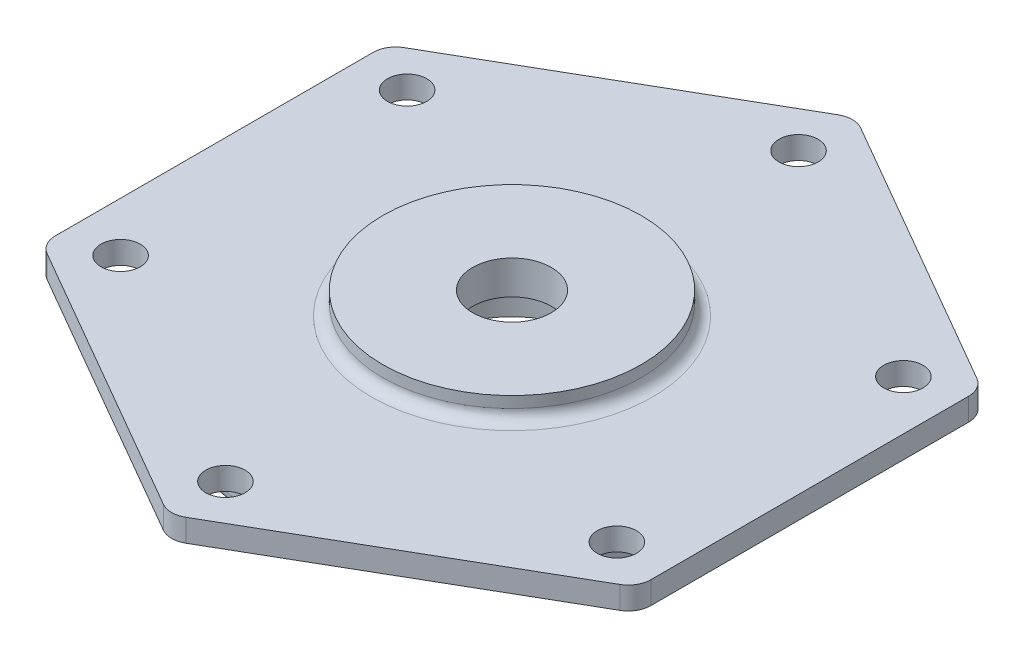
ISO-10303-21;
HEADER;
FILE_DESCRIPTION(('STEP AP214'),'2;1');
FILE_NAME('part.step','',(''),(''),'','','');
FILE_SCHEMA(('AUTOMOTIVE_DESIGN { 1 0 10303 214 1 1 1 1 }'));
ENDSEC;
DATA;
#1=APPLICATION_CONTEXT('core data for automotive mechanical design processes');
#2=APPLICATION_PROTOCOL_DEFINITION('international standard','automotive_design',2000,#1);
#3=PRODUCT_CONTEXT('',#1,'mechanical');
#4=PRODUCT('Part','Part','',(#3));
#5=PRODUCT_RELATED_PRODUCT_CATEGORY('part','',(#4));
#6=PRODUCT_DEFINITION_FORMATION('','',#4);
#7=PRODUCT_DEFINITION_CONTEXT('part definition',#1,'design');
#8=PRODUCT_DEFINITION('design','',#6,#7);
#9=PRODUCT_DEFINITION_SHAPE('','',#8);
#10=(LENGTH_UNIT() NAMED_UNIT(*) SI_UNIT(.MILLI.,.METRE.));
#11=(NAMED_UNIT(*) PLANE_ANGLE_UNIT() SI_UNIT($,.RADIAN.));
#12=(NAMED_UNIT(*) SI_UNIT($,.STERADIAN.) SOLID_ANGLE_UNIT());
#13=UNCERTAINTY_MEASURE_WITH_UNIT(LENGTH_MEASURE(1.E-05),#10,'distance_accuracy_value','');
#14=(GEOMETRIC_REPRESENTATION_CONTEXT(3) GLOBAL_UNCERTAINTY_ASSIGNED_CONTEXT((#13)) GLOBAL_UNIT_ASSIGNED_CONTEXT((#10,
#11,#12)) REPRESENTATION_CONTEXT('',''));
#15=CARTESIAN_POINT('',(0.,0.,0.));
#16=DIRECTION('',(0.,0.,1.));
#17=DIRECTION('',(1.,0.,0.));
#18=AXIS2_PLACEMENT_3D('',#15,#16,#17);
#19=CARTESIAN_POINT('',(48.9999999999997,4.,-28.2901631902923));
#20=DIRECTION('',(0.,-1.,0.));
#21=DIRECTION('',(0.,0.,-1.));
#22=AXIS2_PLACEMENT_3D('',#19,#20,#21);
#23=CYLINDRICAL_SURFACE('',#22,4.);
#24=CARTESIAN_POINT('',(48.9999999999997,0.,-28.2901631902923));
#25=DIRECTION('',(0.,1.,0.));
#26=DIRECTION('',(0.,0.,1.));
#27=AXIS2_PLACEMENT_3D('',#24,#25,#26);
#28=CIRCLE('',#27,4.);
#29=CARTESIAN_POINT('',(52.9999999999997,0.,-28.2901631902923));
#30=VERTEX_POINT('',#29);
#31=CARTESIAN_POINT('',(50.9999999999997,0.,-31.75426480543));
#32=VERTEX_POINT('',#31);
#33=EDGE_CURVE('E164',#30,#32,#28,.T.);
#34=ORIENTED_EDGE('',*,*,#33,.T.);
#35=DIRECTION('',(0.,-1.,0.));
#36=VECTOR('',#35,1.);
#37=CARTESIAN_POINT('',(50.9999999999997,4.,-31.75426480543));
#38=LINE('',#37,#36);
#39=CARTESIAN_POINT('',(50.9999999999997,4.,-31.75426480543));
#40=VERTEX_POINT('',#39);
#41=EDGE_CURVE('E212',#40,#32,#38,.T.);
#42=ORIENTED_EDGE('',*,*,#41,.F.);
#43=CARTESIAN_POINT('',(48.9999999999997,4.,-28.2901631902923));
#44=DIRECTION('',(0.,1.,0.));
#45=DIRECTION('',(0.,0.,1.));
#46=AXIS2_PLACEMENT_3D('',#43,#44,#45);
#47=CIRCLE('',#46,4.);
#48=CARTESIAN_POINT('',(52.9999999999997,4.,-28.2901631902923));
#49=VERTEX_POINT('',#48);
#50=EDGE_CURVE('E187',#49,#40,#47,.T.);
#51=ORIENTED_EDGE('',*,*,#50,.F.);
#52=DIRECTION('',(0.,-1.,0.));
#53=VECTOR('',#52,1.);
#54=CARTESIAN_POINT('',(52.9999999999997,4.,-28.2901631902923));
#55=LINE('',#54,#53);
#56=EDGE_CURVE('E160',#49,#30,#55,.T.);
#57=ORIENTED_EDGE('',*,*,#56,.T.);
#58=EDGE_LOOP('',(#34,#42,#51,#57));
#59=FACE_BOUND('',#58,.T.);
#60=ADVANCED_FACE('F40',(#59),#23,.T.);
#61=CARTESIAN_POINT('',(50.9999999999997,4.,-31.75426480543));
#62=DIRECTION('',(-0.499999999999995,0.,0.866025403784441));
#63=DIRECTION('',(0.866025403784442,0.,0.499999999999995));
#64=AXIS2_PLACEMENT_3D('',#61,#62,#63);
#65=PLANE('',#64);
#66=DIRECTION('',(-0.866025403784441,0.,-0.499999999999995));
#67=VECTOR('',#66,1.);
#68=CARTESIAN_POINT('',(50.9999999999997,0.,-31.75426480543));
#69=LINE('',#68,#67);
#70=CARTESIAN_POINT('',(2.00000000000001,0.,-60.0444279957211));
#71=VERTEX_POINT('',#70);
#72=EDGE_CURVE('E167',#32,#71,#69,.T.);
#73=ORIENTED_EDGE('',*,*,#72,.T.);
#74=DIRECTION('',(0.,-1.,0.));
#75=VECTOR('',#74,1.);
#76=CARTESIAN_POINT('',(2.00000000000001,4.,-60.0444279957211));
#77=LINE('',#76,#75);
#78=CARTESIAN_POINT('',(2.00000000000001,4.,-60.0444279957211));
#79=VERTEX_POINT('',#78);
#80=EDGE_CURVE('E209',#79,#71,#77,.T.);
#81=ORIENTED_EDGE('',*,*,#80,.F.);
#82=DIRECTION('',(-0.866025403784441,0.,-0.499999999999995));
#83=VECTOR('',#82,1.);
#84=CARTESIAN_POINT('',(50.9999999999997,4.,-31.75426480543));
#85=LINE('',#84,#83);
#86=EDGE_CURVE('E115',#40,#79,#85,.T.);
#87=ORIENTED_EDGE('',*,*,#86,.F.);
#88=ORIENTED_EDGE('',*,*,#41,.T.);
#89=EDGE_LOOP('',(#73,#81,#87,#88));
#90=FACE_BOUND('',#89,.T.);
#91=ADVANCED_FACE('F319',(#90),#65,.F.);
#92=CARTESIAN_POINT('',(0.,4.,-56.5803263805834));
#93=DIRECTION('',(0.,-1.,0.));
#94=DIRECTION('',(0.,0.,-1.));
#95=AXIS2_PLACEMENT_3D('',#92,#93,#94);
#96=CYLINDRICAL_SURFACE('',#95,4.);
#97=CARTESIAN_POINT('',(0.,0.,-56.5803263805834));
#98=DIRECTION('',(0.,1.,0.));
#99=DIRECTION('',(0.,0.,-1.));
#100=AXIS2_PLACEMENT_3D('',#97,#98,#99);
#101=CIRCLE('',#100,4.);
#102=CARTESIAN_POINT('',(-2.00000000000001,0.,-60.0444279957211));
#103=VERTEX_POINT('',#102);
#104=EDGE_CURVE('E170',#71,#103,#101,.T.);
#105=ORIENTED_EDGE('',*,*,#104,.T.);
#106=DIRECTION('',(0.,-1.,0.));
#107=VECTOR('',#106,1.);
#108=CARTESIAN_POINT('',(-2.00000000000001,4.,-60.0444279957211));
#109=LINE('',#108,#107);
#110=CARTESIAN_POINT('',(-2.00000000000001,4.,-60.0444279957211));
#111=VERTEX_POINT('',#110);
#112=EDGE_CURVE('E206',#111,#103,#109,.T.);
#113=ORIENTED_EDGE('',*,*,#112,.F.);
#114=CARTESIAN_POINT('',(0.,4.,-56.5803263805834));
#115=DIRECTION('',(0.,1.,0.));
#116=DIRECTION('',(0.,0.,-1.));
#117=AXIS2_PLACEMENT_3D('',#114,#115,#116);
#118=CIRCLE('',#117,4.);
#119=EDGE_CURVE('E279',#79,#111,#118,.T.);
#120=ORIENTED_EDGE('',*,*,#119,.F.);
#121=ORIENTED_EDGE('',*,*,#80,.T.);
#122=EDGE_LOOP('',(#105,#113,#120,#121));
#123=FACE_BOUND('',#122,.T.);
#124=ADVANCED_FACE('F324',(#123),#96,.T.);
#125=CARTESIAN_POINT('',(-2.00000000000001,4.,-60.0444279957211));
#126=DIRECTION('',(0.500000000000001,0.,0.866025403784438));
#127=DIRECTION('',(0.866025403784438,0.,-0.500000000000001));
#128=AXIS2_PLACEMENT_3D('',#125,#126,#127);
#129=PLANE('',#128);
#130=DIRECTION('',(-0.866025403784438,0.,0.500000000000001));
#131=VECTOR('',#130,1.);
#132=CARTESIAN_POINT('',(-2.00000000000001,0.,-60.0444279957211));
#133=LINE('',#132,#131);
#134=CARTESIAN_POINT('',(-51.0000000000001,0.,-31.7542648054293));
#135=VERTEX_POINT('',#134);
#136=EDGE_CURVE('E172',#103,#135,#133,.T.);
#137=ORIENTED_EDGE('',*,*,#136,.T.);
#138=DIRECTION('',(0.,-1.,0.));
#139=VECTOR('',#138,1.);
#140=CARTESIAN_POINT('',(-51.0000000000001,4.,-31.7542648054293));
#141=LINE('',#140,#139);
#142=CARTESIAN_POINT('',(-51.0000000000001,4.,-31.7542648054293));
#143=VERTEX_POINT('',#142);
#144=EDGE_CURVE('E203',#143,#135,#141,.T.);
#145=ORIENTED_EDGE('',*,*,#144,.F.);
#146=DIRECTION('',(-0.866025403784438,0.,0.500000000000001));
#147=VECTOR('',#146,1.);
#148=CARTESIAN_POINT('',(-2.00000000000001,4.,-60.0444279957211));
#149=LINE('',#148,#147);
#150=EDGE_CURVE('E281',#111,#143,#149,.T.);
#151=ORIENTED_EDGE('',*,*,#150,.F.);
#152=ORIENTED_EDGE('',*,*,#112,.T.);
#153=EDGE_LOOP('',(#137,#145,#151,#152));
#154=FACE_BOUND('',#153,.T.);
#155=ADVANCED_FACE('F660',(#154),#129,.F.);
#156=CARTESIAN_POINT('',(-49.0000000000001,4.,-28.2901631902916));
#157=DIRECTION('',(0.,-1.,0.));
#158=DIRECTION('',(0.,0.,-1.));
#159=AXIS2_PLACEMENT_3D('',#156,#157,#158);
#160=CYLINDRICAL_SURFACE('',#159,4.);
#161=CARTESIAN_POINT('',(-49.0000000000001,0.,-28.2901631902916));
#162=DIRECTION('',(0.,1.,0.));
#163=DIRECTION('',(0.,0.,1.));
#164=AXIS2_PLACEMENT_3D('',#161,#162,#163);
#165=CIRCLE('',#164,4.);
#166=CARTESIAN_POINT('',(-53.0000000000001,0.,-28.2901631902915));
#167=VERTEX_POINT('',#166);
#168=EDGE_CURVE('E174',#135,#167,#165,.T.);
#169=ORIENTED_EDGE('',*,*,#168,.T.);
#170=DIRECTION('',(0.,-1.,0.));
#171=VECTOR('',#170,1.);
#172=CARTESIAN_POINT('',(-53.0000000000001,4.,-28.2901631902915));
#173=LINE('',#172,#171);
#174=CARTESIAN_POINT('',(-53.0000000000001,4.,-28.2901631902915));
#175=VERTEX_POINT('',#174);
#176=EDGE_CURVE('E200',#175,#167,#173,.T.);
#177=ORIENTED_EDGE('',*,*,#176,.F.);
#178=CARTESIAN_POINT('',(-49.0000000000001,4.,-28.2901631902916));
#179=DIRECTION('',(0.,1.,0.));
#180=DIRECTION('',(0.,0.,1.));
#181=AXIS2_PLACEMENT_3D('',#178,#179,#180);
#182=CIRCLE('',#181,4.);
#183=EDGE_CURVE('E283',#143,#175,#182,.T.);
#184=ORIENTED_EDGE('',*,*,#183,.F.);
#185=ORIENTED_EDGE('',*,*,#144,.T.);
#186=EDGE_LOOP('',(#169,#177,#184,#185));
#187=FACE_BOUND('',#186,.T.);
#188=ADVANCED_FACE('F650',(#187),#160,.T.);
#189=CARTESIAN_POINT('',(-53.0000000000001,4.,-28.2901631902915));
#190=DIRECTION('',(1.,0.,0.));
#191=DIRECTION('',(0.,0.,-1.));
#192=AXIS2_PLACEMENT_3D('',#189,#190,#191);
#193=PLANE('',#192);
#194=DIRECTION('',(0.,0.,1.));
#195=VECTOR('',#194,1.);
#196=CARTESIAN_POINT('',(-53.0000000000001,0.,-28.2901631902915));
#197=LINE('',#196,#195);
#198=CARTESIAN_POINT('',(-52.9999999999999,0.,28.2901631902919));
#199=VERTEX_POINT('',#198);
#200=EDGE_CURVE('E176',#167,#199,#197,.T.);
#201=ORIENTED_EDGE('',*,*,#200,.T.);
#202=DIRECTION('',(0.,-1.,0.));
#203=VECTOR('',#202,1.);
#204=CARTESIAN_POINT('',(-52.9999999999999,4.,28.2901631902919));
#205=LINE('',#204,#203);
#206=CARTESIAN_POINT('',(-52.9999999999999,4.,28.2901631902919));
#207=VERTEX_POINT('',#206);
#208=EDGE_CURVE('E197',#207,#199,#205,.T.);
#209=ORIENTED_EDGE('',*,*,#208,.F.);
#210=DIRECTION('',(0.,0.,1.));
#211=VECTOR('',#210,1.);
#212=CARTESIAN_POINT('',(-53.0000000000001,4.,-28.2901631902915));
#213=LINE('',#212,#211);
#214=EDGE_CURVE('E285',#175,#207,#213,.T.);
#215=ORIENTED_EDGE('',*,*,#214,.F.);
#216=ORIENTED_EDGE('',*,*,#176,.T.);
#217=EDGE_LOOP('',(#201,#209,#215,#216));
#218=FACE_BOUND('',#217,.T.);
#219=ADVANCED_FACE('F640',(#218),#193,.F.);
#220=CARTESIAN_POINT('',(-48.9999999999999,4.,28.2901631902919));
#221=DIRECTION('',(0.,-1.,0.));
#222=DIRECTION('',(0.,0.,-1.));
#223=AXIS2_PLACEMENT_3D('',#220,#221,#222);
#224=CYLINDRICAL_SURFACE('',#223,4.);
#225=CARTESIAN_POINT('',(-48.9999999999999,0.,28.2901631902919));
#226=DIRECTION('',(0.,1.,0.));
#227=DIRECTION('',(0.,0.,1.));
#228=AXIS2_PLACEMENT_3D('',#225,#226,#227);
#229=CIRCLE('',#228,4.);
#230=CARTESIAN_POINT('',(-50.9999999999999,0.,31.7542648054297));
#231=VERTEX_POINT('',#230);
#232=EDGE_CURVE('E178',#199,#231,#229,.T.);
#233=ORIENTED_EDGE('',*,*,#232,.T.);
#234=DIRECTION('',(0.,-1.,0.));
#235=VECTOR('',#234,1.);
#236=CARTESIAN_POINT('',(-50.9999999999999,4.,31.7542648054297));
#237=LINE('',#236,#235);
#238=CARTESIAN_POINT('',(-50.9999999999999,4.,31.7542648054297));
#239=VERTEX_POINT('',#238);
#240=EDGE_CURVE('E194',#239,#231,#237,.T.);
#241=ORIENTED_EDGE('',*,*,#240,.F.);
#242=CARTESIAN_POINT('',(-48.9999999999999,4.,28.2901631902919));
#243=DIRECTION('',(0.,1.,0.));
#244=DIRECTION('',(0.,0.,1.));
#245=AXIS2_PLACEMENT_3D('',#242,#243,#244);
#246=CIRCLE('',#245,4.);
#247=EDGE_CURVE('E287',#207,#239,#246,.T.);
#248=ORIENTED_EDGE('',*,*,#247,.F.);
#249=ORIENTED_EDGE('',*,*,#208,.T.);
#250=EDGE_LOOP('',(#233,#241,#248,#249));
#251=FACE_BOUND('',#250,.T.);
#252=ADVANCED_FACE('F631',(#251),#224,.T.);
#253=CARTESIAN_POINT('',(-50.9999999999999,4.,31.7542648054297));
#254=DIRECTION('',(0.499999999999995,0.,-0.866025403784442));
#255=DIRECTION('',(-0.866025403784442,0.,-0.499999999999995));
#256=AXIS2_PLACEMENT_3D('',#253,#254,#255);
#257=PLANE('',#256);
#258=DIRECTION('',(0.866025403784442,0.,0.499999999999995));
#259=VECTOR('',#258,1.);
#260=CARTESIAN_POINT('',(-50.9999999999999,0.,31.7542648054297));
#261=LINE('',#260,#259);
#262=CARTESIAN_POINT('',(-1.9999999999996,0.,60.0444279957211));
#263=VERTEX_POINT('',#262);
#264=EDGE_CURVE('E180',#231,#263,#261,.T.);
#265=ORIENTED_EDGE('',*,*,#264,.T.);
#266=DIRECTION('',(0.,-1.,0.));
#267=VECTOR('',#266,1.);
#268=CARTESIAN_POINT('',(-1.9999999999996,4.,60.0444279957211));
#269=LINE('',#268,#267);
#270=CARTESIAN_POINT('',(-1.9999999999996,4.,60.0444279957211));
#271=VERTEX_POINT('',#270);
#272=EDGE_CURVE('E191',#271,#263,#269,.T.);
#273=ORIENTED_EDGE('',*,*,#272,.F.);
#274=DIRECTION('',(0.866025403784442,0.,0.499999999999995));
#275=VECTOR('',#274,1.);
#276=CARTESIAN_POINT('',(-50.9999999999999,4.,31.7542648054297));
#277=LINE('',#276,#275);
#278=EDGE_CURVE('E289',#239,#271,#277,.T.);
#279=ORIENTED_EDGE('',*,*,#278,.F.);
#280=ORIENTED_EDGE('',*,*,#240,.T.);
#281=EDGE_LOOP('',(#265,#273,#279,#280));
#282=FACE_BOUND('',#281,.T.);
#283=ADVANCED_FACE('F295',(#282),#257,.F.);
#284=CARTESIAN_POINT('',(3.95558247379006E-13,4.,56.5803263805834));
#285=DIRECTION('',(0.,-1.,0.));
#286=DIRECTION('',(0.,0.,-1.));
#287=AXIS2_PLACEMENT_3D('',#284,#285,#286);
#288=CYLINDRICAL_SURFACE('',#287,4.);
#289=CARTESIAN_POINT('',(3.95558247379006E-13,0.,56.5803263805834));
#290=DIRECTION('',(0.,1.,0.));
#291=DIRECTION('',(0.,0.,1.));
#292=AXIS2_PLACEMENT_3D('',#289,#290,#291);
#293=CIRCLE('',#292,4.);
#294=CARTESIAN_POINT('',(2.00000000000044,0.,60.0444279957211));
#295=VERTEX_POINT('',#294);
#296=EDGE_CURVE('E182',#263,#295,#293,.T.);
#297=ORIENTED_EDGE('',*,*,#296,.T.);
#298=DIRECTION('',(0.,-1.,0.));
#299=VECTOR('',#298,1.);
#300=CARTESIAN_POINT('',(2.00000000000044,4.,60.0444279957211));
#301=LINE('',#300,#299);
#302=CARTESIAN_POINT('',(2.00000000000044,4.,60.0444279957211));
#303=VERTEX_POINT('',#302);
#304=EDGE_CURVE('E155',#303,#295,#301,.T.);
#305=ORIENTED_EDGE('',*,*,#304,.F.);
#306=CARTESIAN_POINT('',(3.95558247379006E-13,4.,56.5803263805834));
#307=DIRECTION('',(0.,1.,0.));
#308=DIRECTION('',(0.,0.,1.));
#309=AXIS2_PLACEMENT_3D('',#306,#307,#308);
#310=CIRCLE('',#309,4.);
#311=EDGE_CURVE('E146',#271,#303,#310,.T.);
#312=ORIENTED_EDGE('',*,*,#311,.F.);
#313=ORIENTED_EDGE('',*,*,#272,.T.);
#314=EDGE_LOOP('',(#297,#305,#312,#313));
#315=FACE_BOUND('',#314,.T.);
#316=ADVANCED_FACE('F299',(#315),#288,.T.);
#317=CARTESIAN_POINT('',(2.00000000000044,4.,60.0444279957211));
#318=DIRECTION('',(-0.500000000000007,0.,-0.866025403784435));
#319=DIRECTION('',(-0.866025403784434,0.,0.500000000000007));
#320=AXIS2_PLACEMENT_3D('',#317,#318,#319);
#321=PLANE('',#320);
#322=DIRECTION('',(0.866025403784434,0.,-0.500000000000007));
#323=VECTOR('',#322,1.);
#324=CARTESIAN_POINT('',(2.00000000000044,0.,60.0444279957211));
#325=LINE('',#324,#323);
#326=CARTESIAN_POINT('',(51.0000000000003,0.,31.754264805429));
#327=VERTEX_POINT('',#326);
#328=EDGE_CURVE('E154',#295,#327,#325,.T.);
#329=ORIENTED_EDGE('',*,*,#328,.T.);
#330=DIRECTION('',(0.,-1.,0.));
#331=VECTOR('',#330,1.);
#332=CARTESIAN_POINT('',(51.0000000000003,4.,31.754264805429));
#333=LINE('',#332,#331);
#334=CARTESIAN_POINT('',(51.0000000000003,4.,31.754264805429));
#335=VERTEX_POINT('',#334);
#336=EDGE_CURVE('E151',#335,#327,#333,.T.);
#337=ORIENTED_EDGE('',*,*,#336,.F.);
#338=DIRECTION('',(0.866025403784434,0.,-0.500000000000007));
#339=VECTOR('',#338,1.);
#340=CARTESIAN_POINT('',(2.00000000000044,4.,60.0444279957211));
#341=LINE('',#340,#339);
#342=EDGE_CURVE('E140',#303,#335,#341,.T.);
#343=ORIENTED_EDGE('',*,*,#342,.F.);
#344=ORIENTED_EDGE('',*,*,#304,.T.);
#345=EDGE_LOOP('',(#329,#337,#343,#344));
#346=FACE_BOUND('',#345,.T.);
#347=ADVANCED_FACE('F152',(#346),#321,.F.);
#348=CARTESIAN_POINT('',(49.0000000000003,4.,28.2901631902912));
#349=DIRECTION('',(0.,-1.,0.));
#350=DIRECTION('',(0.,0.,-1.));
#351=AXIS2_PLACEMENT_3D('',#348,#349,#350);
#352=CYLINDRICAL_SURFACE('',#351,4.);
#353=CARTESIAN_POINT('',(49.0000000000003,0.,28.2901631902912));
#354=DIRECTION('',(0.,1.,0.));
#355=DIRECTION('',(0.,0.,1.));
#356=AXIS2_PLACEMENT_3D('',#353,#354,#355);
#357=CIRCLE('',#356,4.);
#358=CARTESIAN_POINT('',(53.0000000000003,0.,28.2901631902912));
#359=VERTEX_POINT('',#358);
#360=EDGE_CURVE('E100',#327,#359,#357,.T.);
#361=ORIENTED_EDGE('',*,*,#360,.T.);
#362=DIRECTION('',(0.,-1.,0.));
#363=VECTOR('',#362,1.);
#364=CARTESIAN_POINT('',(53.0000000000003,4.,28.2901631902912));
#365=LINE('',#364,#363);
#366=CARTESIAN_POINT('',(53.0000000000003,4.,28.2901631902912));
#367=VERTEX_POINT('',#366);
#368=EDGE_CURVE('E156',#367,#359,#365,.T.);
#369=ORIENTED_EDGE('',*,*,#368,.F.);
#370=CARTESIAN_POINT('',(49.0000000000003,4.,28.2901631902912));
#371=DIRECTION('',(0.,1.,0.));
#372=DIRECTION('',(0.,0.,1.));
#373=AXIS2_PLACEMENT_3D('',#370,#371,#372);
#374=CIRCLE('',#373,4.);
#375=EDGE_CURVE('E144',#335,#367,#374,.T.);
#376=ORIENTED_EDGE('',*,*,#375,.F.);
#377=ORIENTED_EDGE('',*,*,#336,.T.);
#378=EDGE_LOOP('',(#361,#369,#376,#377));
#379=FACE_BOUND('',#378,.T.);
#380=ADVANCED_FACE('F158',(#379),#352,.T.);
#381=CARTESIAN_POINT('',(53.0000000000003,4.,28.2901631902912));
#382=DIRECTION('',(-1.,0.,0.));
#383=DIRECTION('',(0.,0.,1.));
#384=AXIS2_PLACEMENT_3D('',#381,#382,#383);
#385=PLANE('',#384);
#386=DIRECTION('',(0.,0.,-1.));
#387=VECTOR('',#386,1.);
#388=CARTESIAN_POINT('',(53.0000000000003,0.,28.2901631902912));
#389=LINE('',#388,#387);
#390=EDGE_CURVE('E106',#359,#30,#389,.T.);
#391=ORIENTED_EDGE('',*,*,#390,.T.);
#392=ORIENTED_EDGE('',*,*,#56,.F.);
#393=DIRECTION('',(0.,0.,-1.));
#394=VECTOR('',#393,1.);
#395=CARTESIAN_POINT('',(53.0000000000003,4.,28.2901631902912));
#396=LINE('',#395,#394);
#397=EDGE_CURVE('E59',#367,#49,#396,.T.);
#398=ORIENTED_EDGE('',*,*,#397,.F.);
#399=ORIENTED_EDGE('',*,*,#368,.T.);
#400=EDGE_LOOP('',(#391,#392,#398,#399));
#401=FACE_BOUND('',#400,.T.);
#402=ADVANCED_FACE('F307',(#401),#385,.F.);
#403=CARTESIAN_POINT('',(48.9999999999997,4.,-28.2901631902923));
#404=DIRECTION('',(0.,1.,0.));
#405=DIRECTION('',(0.,0.,1.));
#406=AXIS2_PLACEMENT_3D('',#403,#404,#405);
#407=PLANE('',#406);
#408=CARTESIAN_POINT('',(0.,4.,-51.));
#409=DIRECTION('',(0.,1.,0.));
#410=DIRECTION('',(0.,0.,1.));
#411=AXIS2_PLACEMENT_3D('',#408,#409,#410);
#412=CIRCLE('',#411,3.5);
#413=CARTESIAN_POINT('',(0.,4.,-47.5));
#414=VERTEX_POINT('',#413);
#415=EDGE_CURVE('E233',#414,#414,#412,.T.);
#416=ORIENTED_EDGE('',*,*,#415,.F.);
#417=EDGE_LOOP('',(#416));
#418=FACE_BOUND('',#417,.T.);
#419=CARTESIAN_POINT('',(-44.1672955930053,4.,-25.4999999999981));
#420=DIRECTION('',(0.,1.,0.));
#421=DIRECTION('',(0.,0.,1.));
#422=AXIS2_PLACEMENT_3D('',#419,#420,#421);
#423=CIRCLE('',#422,3.50000000000219);
#424=CARTESIAN_POINT('',(-44.1672955930053,4.,-21.9999999999959));
#425=VERTEX_POINT('',#424);
#426=EDGE_CURVE('E748',#425,#425,#423,.T.);
#427=ORIENTED_EDGE('',*,*,#426,.F.);
#428=EDGE_LOOP('',(#427));
#429=FACE_BOUND('',#428,.T.);
#430=CARTESIAN_POINT('',(-44.1672955930031,4.,25.5000000000019));
#431=DIRECTION('',(0.,1.,0.));
#432=DIRECTION('',(0.,0.,1.));
#433=AXIS2_PLACEMENT_3D('',#430,#431,#432);
#434=CIRCLE('',#433,3.50000000000413);
#435=CARTESIAN_POINT('',(-44.1672955930031,4.,29.000000000006));
#436=VERTEX_POINT('',#435);
#437=EDGE_CURVE('E750',#436,#436,#434,.T.);
#438=ORIENTED_EDGE('',*,*,#437,.F.);
#439=EDGE_LOOP('',(#438));
#440=FACE_BOUND('',#439,.T.);
#441=CARTESIAN_POINT('',(4.32978444682486E-12,4.,51.));
#442=DIRECTION('',(0.,1.,0.));
#443=DIRECTION('',(0.,0.,1.));
#444=AXIS2_PLACEMENT_3D('',#441,#442,#443);
#445=CIRCLE('',#444,3.50000000000448);
#446=CARTESIAN_POINT('',(4.32978444682486E-12,4.,54.5000000000045));
#447=VERTEX_POINT('',#446);
#448=EDGE_CURVE('E754',#447,#447,#445,.T.);
#449=ORIENTED_EDGE('',*,*,#448,.F.);
#450=EDGE_LOOP('',(#449));
#451=FACE_BOUND('',#450,.T.);
#452=CARTESIAN_POINT('',(44.1672955930096,4.,25.4999999999981));
#453=DIRECTION('',(0.,1.,0.));
#454=DIRECTION('',(0.,0.,1.));
#455=AXIS2_PLACEMENT_3D('',#452,#453,#454);
#456=CIRCLE('',#455,3.50000000000279);
#457=CARTESIAN_POINT('',(44.1672955930096,4.,29.0000000000009));
#458=VERTEX_POINT('',#457);
#459=EDGE_CURVE('E745',#458,#458,#456,.T.);
#460=ORIENTED_EDGE('',*,*,#459,.F.);
#461=EDGE_LOOP('',(#460));
#462=FACE_BOUND('',#461,.T.);
#463=CARTESIAN_POINT('',(44.1672955930074,4.,-25.5000000000019));
#464=DIRECTION('',(0.,1.,0.));
#465=DIRECTION('',(0.,0.,1.));
#466=AXIS2_PLACEMENT_3D('',#463,#464,#465);
#467=CIRCLE('',#466,3.50000000000063);
#468=CARTESIAN_POINT('',(44.1672955930074,4.,-22.0000000000013));
#469=VERTEX_POINT('',#468);
#470=EDGE_CURVE('E743',#469,#469,#467,.T.);
#471=ORIENTED_EDGE('',*,*,#470,.F.);
#472=EDGE_LOOP('',(#471));
#473=FACE_BOUND('',#472,.T.);
#474=CARTESIAN_POINT('',(0.,4.,0.));
#475=DIRECTION('',(0.,1.,0.));
#476=DIRECTION('',(0.,0.,1.));
#477=AXIS2_PLACEMENT_3D('',#474,#475,#476);
#478=CIRCLE('',#477,25.);
#479=CARTESIAN_POINT('',(0.,4.,25.));
#480=VERTEX_POINT('',#479);
#481=EDGE_CURVE('E218',#480,#480,#478,.F.);
#482=ORIENTED_EDGE('',*,*,#481,.T.);
#483=EDGE_LOOP('',(#482));
#484=FACE_BOUND('',#483,.T.);
#485=ORIENTED_EDGE('',*,*,#50,.T.);
#486=ORIENTED_EDGE('',*,*,#86,.T.);
#487=ORIENTED_EDGE('',*,*,#119,.T.);
#488=ORIENTED_EDGE('',*,*,#150,.T.);
#489=ORIENTED_EDGE('',*,*,#183,.T.);
#490=ORIENTED_EDGE('',*,*,#214,.T.);
#491=ORIENTED_EDGE('',*,*,#247,.T.);
#492=ORIENTED_EDGE('',*,*,#278,.T.);
#493=ORIENTED_EDGE('',*,*,#311,.T.);
#494=ORIENTED_EDGE('',*,*,#342,.T.);
#495=ORIENTED_EDGE('',*,*,#375,.T.);
#496=ORIENTED_EDGE('',*,*,#397,.T.);
#497=EDGE_LOOP('',(#485,#486,#487,#488,#489,#490,#491,#492,#493,#494,#495,#496));
#498=FACE_BOUND('',#497,.T.);
#499=ADVANCED_FACE('F142',(#418,#429,#440,#451,#462,#473,#484,#498),#407,.T.);
#500=CARTESIAN_POINT('',(48.9999999999997,0.,-28.2901631902923));
#501=DIRECTION('',(0.,1.,0.));
#502=DIRECTION('',(0.,0.,1.));
#503=AXIS2_PLACEMENT_3D('',#500,#501,#502);
#504=PLANE('',#503);
#505=CARTESIAN_POINT('',(0.,0.,-51.));
#506=DIRECTION('',(0.,1.,0.));
#507=DIRECTION('',(0.,0.,1.));
#508=AXIS2_PLACEMENT_3D('',#505,#506,#507);
#509=CIRCLE('',#508,3.5);
#510=CARTESIAN_POINT('',(0.,0.,-47.5));
#511=VERTEX_POINT('',#510);
#512=EDGE_CURVE('E44',#511,#511,#509,.T.);
#513=ORIENTED_EDGE('',*,*,#512,.T.);
#514=EDGE_LOOP('',(#513));
#515=FACE_BOUND('',#514,.T.);
#516=CARTESIAN_POINT('',(-44.1672955930053,0.,-25.4999999999981));
#517=DIRECTION('',(0.,1.,0.));
#518=DIRECTION('',(0.,0.,1.));
#519=AXIS2_PLACEMENT_3D('',#516,#517,#518);
#520=CIRCLE('',#519,3.50000000000219);
#521=CARTESIAN_POINT('',(-44.1672955930053,0.,-21.9999999999959));
#522=VERTEX_POINT('',#521);
#523=EDGE_CURVE('E241',#522,#522,#520,.T.);
#524=ORIENTED_EDGE('',*,*,#523,.T.);
#525=EDGE_LOOP('',(#524));
#526=FACE_BOUND('',#525,.T.);
#527=CARTESIAN_POINT('',(-44.1672955930031,0.,25.5000000000019));
#528=DIRECTION('',(0.,1.,0.));
#529=DIRECTION('',(0.,0.,1.));
#530=AXIS2_PLACEMENT_3D('',#527,#528,#529);
#531=CIRCLE('',#530,3.50000000000413);
#532=CARTESIAN_POINT('',(-44.1672955930031,0.,29.000000000006));
#533=VERTEX_POINT('',#532);
#534=EDGE_CURVE('E239',#533,#533,#531,.T.);
#535=ORIENTED_EDGE('',*,*,#534,.T.);
#536=EDGE_LOOP('',(#535));
#537=FACE_BOUND('',#536,.T.);
#538=CARTESIAN_POINT('',(4.32978444682486E-12,0.,51.));
#539=DIRECTION('',(0.,1.,0.));
#540=DIRECTION('',(0.,0.,1.));
#541=AXIS2_PLACEMENT_3D('',#538,#539,#540);
#542=CIRCLE('',#541,3.50000000000448);
#543=CARTESIAN_POINT('',(4.32978444682486E-12,0.,54.5000000000045));
#544=VERTEX_POINT('',#543);
#545=EDGE_CURVE('E236',#544,#544,#542,.T.);
#546=ORIENTED_EDGE('',*,*,#545,.T.);
#547=EDGE_LOOP('',(#546));
#548=FACE_BOUND('',#547,.T.);
#549=CARTESIAN_POINT('',(44.1672955930096,0.,25.4999999999981));
#550=DIRECTION('',(0.,1.,0.));
#551=DIRECTION('',(0.,0.,1.));
#552=AXIS2_PLACEMENT_3D('',#549,#550,#551);
#553=CIRCLE('',#552,3.50000000000279);
#554=CARTESIAN_POINT('',(44.1672955930096,0.,29.0000000000009));
#555=VERTEX_POINT('',#554);
#556=EDGE_CURVE('E232',#555,#555,#553,.T.);
#557=ORIENTED_EDGE('',*,*,#556,.T.);
#558=EDGE_LOOP('',(#557));
#559=FACE_BOUND('',#558,.T.);
#560=CARTESIAN_POINT('',(44.1672955930074,0.,-25.5000000000019));
#561=DIRECTION('',(0.,1.,0.));
#562=DIRECTION('',(0.,0.,1.));
#563=AXIS2_PLACEMENT_3D('',#560,#561,#562);
#564=CIRCLE('',#563,3.50000000000063);
#565=CARTESIAN_POINT('',(44.1672955930074,0.,-22.0000000000013));
#566=VERTEX_POINT('',#565);
#567=EDGE_CURVE('E229',#566,#566,#564,.T.);
#568=ORIENTED_EDGE('',*,*,#567,.T.);
#569=EDGE_LOOP('',(#568));
#570=FACE_BOUND('',#569,.T.);
#571=CARTESIAN_POINT('',(0.,0.,0.));
#572=DIRECTION('',(0.,-1.,0.));
#573=DIRECTION('',(0.,0.,-1.));
#574=AXIS2_PLACEMENT_3D('',#571,#572,#573);
#575=CIRCLE('',#574,45.);
#576=CARTESIAN_POINT('',(0.,0.,-45.));
#577=VERTEX_POINT('',#576);
#578=EDGE_CURVE('E214',#577,#577,#575,.T.);
#579=ORIENTED_EDGE('',*,*,#578,.F.);
#580=EDGE_LOOP('',(#579));
#581=FACE_BOUND('',#580,.T.);
#582=ORIENTED_EDGE('',*,*,#33,.F.);
#583=ORIENTED_EDGE('',*,*,#390,.F.);
#584=ORIENTED_EDGE('',*,*,#360,.F.);
#585=ORIENTED_EDGE('',*,*,#328,.F.);
#586=ORIENTED_EDGE('',*,*,#296,.F.);
#587=ORIENTED_EDGE('',*,*,#264,.F.);
#588=ORIENTED_EDGE('',*,*,#232,.F.);
#589=ORIENTED_EDGE('',*,*,#200,.F.);
#590=ORIENTED_EDGE('',*,*,#168,.F.);
#591=ORIENTED_EDGE('',*,*,#136,.F.);
#592=ORIENTED_EDGE('',*,*,#104,.F.);
#593=ORIENTED_EDGE('',*,*,#72,.F.);
#594=EDGE_LOOP('',(#582,#583,#584,#585,#586,#587,#588,#589,#590,#591,#592,#593));
#595=FACE_BOUND('',#594,.T.);
#596=ADVANCED_FACE('F302',(#515,#526,#537,#548,#559,#570,#581,#595),#504,.F.);
#597=CARTESIAN_POINT('',(0.,8.,0.));
#598=DIRECTION('',(0.,-1.,0.));
#599=DIRECTION('',(0.,0.,-1.));
#600=AXIS2_PLACEMENT_3D('',#597,#598,#599);
#601=CYLINDRICAL_SURFACE('',#600,23.);
#602=CARTESIAN_POINT('',(0.,6.,0.));
#603=DIRECTION('',(0.,1.,0.));
#604=DIRECTION('',(0.,0.,1.));
#605=AXIS2_PLACEMENT_3D('',#602,#603,#604);
#606=CIRCLE('',#605,23.);
#607=CARTESIAN_POINT('',(0.,6.,23.));
#608=VERTEX_POINT('',#607);
#609=EDGE_CURVE('E215',#608,#608,#606,.T.);
#610=ORIENTED_EDGE('',*,*,#609,.T.);
#611=EDGE_LOOP('',(#610));
#612=FACE_BOUND('',#611,.T.);
#613=CARTESIAN_POINT('',(0.,8.,0.));
#614=DIRECTION('',(0.,1.,0.));
#615=DIRECTION('',(0.,0.,1.));
#616=AXIS2_PLACEMENT_3D('',#613,#614,#615);
#617=CIRCLE('',#616,23.);
#618=CARTESIAN_POINT('',(0.,8.,23.));
#619=VERTEX_POINT('',#618);
#620=EDGE_CURVE('E168',#619,#619,#617,.T.);
#621=ORIENTED_EDGE('',*,*,#620,.F.);
#622=EDGE_LOOP('',(#621));
#623=FACE_BOUND('',#622,.T.);
#624=ADVANCED_FACE('F372',(#612,#623),#601,.T.);
#625=CARTESIAN_POINT('',(0.,8.,0.));
#626=DIRECTION('',(0.,1.,0.));
#627=DIRECTION('',(0.,0.,1.));
#628=AXIS2_PLACEMENT_3D('',#625,#626,#627);
#629=PLANE('',#628);
#630=CARTESIAN_POINT('',(0.,8.,0.));
#631=DIRECTION('',(0.,-1.,0.));
#632=DIRECTION('',(0.,0.,-1.));
#633=AXIS2_PLACEMENT_3D('',#630,#631,#632);
#634=CIRCLE('',#633,7.);
#635=CARTESIAN_POINT('',(0.,8.,-7.));
#636=VERTEX_POINT('',#635);
#637=EDGE_CURVE('E250',#636,#636,#634,.T.);
#638=ORIENTED_EDGE('',*,*,#637,.T.);
#639=EDGE_LOOP('',(#638));
#640=FACE_BOUND('',#639,.T.);
#641=ORIENTED_EDGE('',*,*,#620,.T.);
#642=EDGE_LOOP('',(#641));
#643=FACE_BOUND('',#642,.T.);
#644=ADVANCED_FACE('F368',(#640,#643),#629,.T.);
#645=CARTESIAN_POINT('',(0.,-6.,0.));
#646=DIRECTION('',(0.,1.,0.));
#647=DIRECTION('',(0.,0.,1.));
#648=AXIS2_PLACEMENT_3D('',#645,#646,#647);
#649=CYLINDRICAL_SURFACE('',#648,45.);
#650=CARTESIAN_POINT('',(0.,-4.,0.));
#651=DIRECTION('',(0.,-1.,0.));
#652=DIRECTION('',(0.,0.,-1.));
#653=AXIS2_PLACEMENT_3D('',#650,#651,#652);
#654=CIRCLE('',#653,45.);
#655=CARTESIAN_POINT('',(0.,-4.,-45.));
#656=VERTEX_POINT('',#655);
#657=EDGE_CURVE('E224',#656,#656,#654,.F.);
#658=ORIENTED_EDGE('',*,*,#657,.T.);
#659=EDGE_LOOP('',(#658));
#660=FACE_BOUND('',#659,.T.);
#661=ORIENTED_EDGE('',*,*,#578,.T.);
#662=EDGE_LOOP('',(#661));
#663=FACE_BOUND('',#662,.T.);
#664=ADVANCED_FACE('F348',(#660,#663),#649,.T.);
#665=CARTESIAN_POINT('',(0.,-6.,0.));
#666=DIRECTION('',(0.,-1.,0.));
#667=DIRECTION('',(0.,0.,-1.));
#668=AXIS2_PLACEMENT_3D('',#665,#666,#667);
#669=PLANE('',#668);
#670=CARTESIAN_POINT('',(0.,-6.,0.));
#671=DIRECTION('',(0.,-1.,0.));
#672=DIRECTION('',(0.,0.,-1.));
#673=AXIS2_PLACEMENT_3D('',#670,#671,#672);
#674=CIRCLE('',#673,43.);
#675=CARTESIAN_POINT('',(0.,-6.,-43.));
#676=VERTEX_POINT('',#675);
#677=EDGE_CURVE('E221',#676,#676,#674,.T.);
#678=ORIENTED_EDGE('',*,*,#677,.T.);
#679=EDGE_LOOP('',(#678));
#680=FACE_BOUND('',#679,.T.);
#681=CARTESIAN_POINT('',(0.,-6.,0.));
#682=DIRECTION('',(0.,-1.,0.));
#683=DIRECTION('',(0.,0.,-1.));
#684=AXIS2_PLACEMENT_3D('',#681,#682,#683);
#685=CIRCLE('',#684,40.);
#686=CARTESIAN_POINT('',(0.,-6.,-40.));
#687=VERTEX_POINT('',#686);
#688=EDGE_CURVE('E267',#687,#687,#685,.T.);
#689=ORIENTED_EDGE('',*,*,#688,.F.);
#690=EDGE_LOOP('',(#689));
#691=FACE_BOUND('',#690,.T.);
#692=ADVANCED_FACE('F344',(#680,#691),#669,.T.);
#693=CARTESIAN_POINT('',(0.,0.,0.));
#694=DIRECTION('',(0.,-1.,0.));
#695=DIRECTION('',(0.,0.,-1.));
#696=AXIS2_PLACEMENT_3D('',#693,#694,#695);
#697=CYLINDRICAL_SURFACE('',#696,40.);
#698=CARTESIAN_POINT('',(0.,0.,0.));
#699=DIRECTION('',(0.,-1.,0.));
#700=DIRECTION('',(0.,0.,-1.));
#701=AXIS2_PLACEMENT_3D('',#698,#699,#700);
#702=CIRCLE('',#701,40.);
#703=CARTESIAN_POINT('',(0.,0.,-40.));
#704=VERTEX_POINT('',#703);
#705=EDGE_CURVE('E268',#704,#704,#702,.T.);
#706=ORIENTED_EDGE('',*,*,#705,.F.);
#707=EDGE_LOOP('',(#706));
#708=FACE_BOUND('',#707,.T.);
#709=ORIENTED_EDGE('',*,*,#688,.T.);
#710=EDGE_LOOP('',(#709));
#711=FACE_BOUND('',#710,.T.);
#712=ADVANCED_FACE('F347',(#708,#711),#697,.F.);
#713=CARTESIAN_POINT('',(0.,0.,0.));
#714=DIRECTION('',(0.,-1.,0.));
#715=DIRECTION('',(0.,0.,-1.));
#716=AXIS2_PLACEMENT_3D('',#713,#714,#715);
#717=PLANE('',#716);
#718=CARTESIAN_POINT('',(0.,0.,0.));
#719=DIRECTION('',(0.,-1.,0.));
#720=DIRECTION('',(0.,0.,-1.));
#721=AXIS2_PLACEMENT_3D('',#718,#719,#720);
#722=CIRCLE('',#721,19.);
#723=CARTESIAN_POINT('',(0.,0.,-19.));
#724=VERTEX_POINT('',#723);
#725=EDGE_CURVE('E262',#724,#724,#722,.T.);
#726=ORIENTED_EDGE('',*,*,#725,.F.);
#727=EDGE_LOOP('',(#726));
#728=FACE_BOUND('',#727,.T.);
#729=ORIENTED_EDGE('',*,*,#705,.T.);
#730=EDGE_LOOP('',(#729));
#731=FACE_BOUND('',#730,.T.);
#732=ADVANCED_FACE('F354',(#728,#731),#717,.T.);
#733=CARTESIAN_POINT('',(0.,0.,0.));
#734=DIRECTION('',(0.,-1.,0.));
#735=DIRECTION('',(0.,0.,-1.));
#736=AXIS2_PLACEMENT_3D('',#733,#734,#735);
#737=CYLINDRICAL_SURFACE('',#736,19.);
#738=CARTESIAN_POINT('',(0.,-4.,0.));
#739=DIRECTION('',(0.,-1.,0.));
#740=DIRECTION('',(0.,0.,-1.));
#741=AXIS2_PLACEMENT_3D('',#738,#739,#740);
#742=CIRCLE('',#741,19.);
#743=CARTESIAN_POINT('',(0.,-4.,-19.));
#744=VERTEX_POINT('',#743);
#745=EDGE_CURVE('E11',#744,#744,#742,.F.);
#746=ORIENTED_EDGE('',*,*,#745,.T.);
#747=EDGE_LOOP('',(#746));
#748=FACE_BOUND('',#747,.T.);
#749=ORIENTED_EDGE('',*,*,#725,.T.);
#750=EDGE_LOOP('',(#749));
#751=FACE_BOUND('',#750,.T.);
#752=ADVANCED_FACE('F360',(#748,#751),#737,.T.);
#753=CARTESIAN_POINT('',(0.,-6.,0.));
#754=DIRECTION('',(0.,-1.,0.));
#755=DIRECTION('',(0.,0.,-1.));
#756=AXIS2_PLACEMENT_3D('',#753,#754,#755);
#757=CIRCLE('',#756,17.);
#758=CARTESIAN_POINT('',(0.,-6.,-17.));
#759=VERTEX_POINT('',#758);
#760=EDGE_CURVE('E50',#759,#759,#757,.T.);
#761=ORIENTED_EDGE('',*,*,#760,.T.);
#762=EDGE_LOOP('',(#761));
#763=FACE_BOUND('',#762,.T.);
#764=CARTESIAN_POINT('',(0.,-6.,0.));
#765=DIRECTION('',(0.,-1.,0.));
#766=DIRECTION('',(0.,0.,-1.));
#767=AXIS2_PLACEMENT_3D('',#764,#765,#766);
#768=CIRCLE('',#767,14.);
#769=CARTESIAN_POINT('',(0.,-6.,-14.));
#770=VERTEX_POINT('',#769);
#771=EDGE_CURVE('E255',#770,#770,#768,.T.);
#772=ORIENTED_EDGE('',*,*,#771,.F.);
#773=EDGE_LOOP('',(#772));
#774=FACE_BOUND('',#773,.T.);
#775=ADVANCED_FACE('F350',(#763,#774),#669,.T.);
#776=CARTESIAN_POINT('',(0.,2.,0.));
#777=DIRECTION('',(0.,-1.,0.));
#778=DIRECTION('',(0.,0.,-1.));
#779=AXIS2_PLACEMENT_3D('',#776,#777,#778);
#780=CYLINDRICAL_SURFACE('',#779,14.);
#781=CARTESIAN_POINT('',(0.,2.,0.));
#782=DIRECTION('',(0.,-1.,0.));
#783=DIRECTION('',(0.,0.,-1.));
#784=AXIS2_PLACEMENT_3D('',#781,#782,#783);
#785=CIRCLE('',#784,14.);
#786=CARTESIAN_POINT('',(0.,2.,-14.));
#787=VERTEX_POINT('',#786);
#788=EDGE_CURVE('E259',#787,#787,#785,.T.);
#789=ORIENTED_EDGE('',*,*,#788,.F.);
#790=EDGE_LOOP('',(#789));
#791=FACE_BOUND('',#790,.T.);
#792=ORIENTED_EDGE('',*,*,#771,.T.);
#793=EDGE_LOOP('',(#792));
#794=FACE_BOUND('',#793,.T.);
#795=ADVANCED_FACE('F419',(#791,#794),#780,.F.);
#796=CARTESIAN_POINT('',(0.,2.,0.));
#797=DIRECTION('',(0.,-1.,0.));
#798=DIRECTION('',(0.,0.,-1.));
#799=AXIS2_PLACEMENT_3D('',#796,#797,#798);
#800=PLANE('',#799);
#801=CARTESIAN_POINT('',(0.,2.,0.));
#802=DIRECTION('',(0.,-1.,0.));
#803=DIRECTION('',(0.,0.,-1.));
#804=AXIS2_PLACEMENT_3D('',#801,#802,#803);
#805=CIRCLE('',#804,7.);
#806=CARTESIAN_POINT('',(0.,2.,-7.));
#807=VERTEX_POINT('',#806);
#808=EDGE_CURVE('E246',#807,#807,#805,.T.);
#809=ORIENTED_EDGE('',*,*,#808,.F.);
#810=EDGE_LOOP('',(#809));
#811=FACE_BOUND('',#810,.T.);
#812=ORIENTED_EDGE('',*,*,#788,.T.);
#813=EDGE_LOOP('',(#812));
#814=FACE_BOUND('',#813,.T.);
#815=ADVANCED_FACE('F415',(#811,#814),#800,.T.);
#816=CARTESIAN_POINT('',(0.,8.,0.));
#817=DIRECTION('',(0.,-1.,0.));
#818=DIRECTION('',(0.,0.,-1.));
#819=AXIS2_PLACEMENT_3D('',#816,#817,#818);
#820=CYLINDRICAL_SURFACE('',#819,7.);
#821=ORIENTED_EDGE('',*,*,#637,.F.);
#822=EDGE_LOOP('',(#821));
#823=FACE_BOUND('',#822,.T.);
#824=ORIENTED_EDGE('',*,*,#808,.T.);
#825=EDGE_LOOP('',(#824));
#826=FACE_BOUND('',#825,.T.);
#827=ADVANCED_FACE('F331',(#823,#826),#820,.F.);
#828=CARTESIAN_POINT('',(0.,6.,0.));
#829=DIRECTION('',(0.,1.,0.));
#830=DIRECTION('',(0.,0.,1.));
#831=AXIS2_PLACEMENT_3D('',#828,#829,#830);
#832=TOROIDAL_SURFACE('',#831,25.,2.);
#833=ORIENTED_EDGE('',*,*,#481,.F.);
#834=EDGE_LOOP('',(#833));
#835=FACE_BOUND('',#834,.T.);
#836=ORIENTED_EDGE('',*,*,#609,.F.);
#837=EDGE_LOOP('',(#836));
#838=FACE_BOUND('',#837,.T.);
#839=ADVANCED_FACE('F328',(#835,#838),#832,.F.);
#840=CARTESIAN_POINT('',(0.,-4.,0.));
#841=DIRECTION('',(0.,-1.,0.));
#842=DIRECTION('',(0.,0.,-1.));
#843=AXIS2_PLACEMENT_3D('',#840,#841,#842);
#844=TOROIDAL_SURFACE('',#843,43.,2.);
#845=ORIENTED_EDGE('',*,*,#657,.F.);
#846=EDGE_LOOP('',(#845));
#847=FACE_BOUND('',#846,.T.);
#848=ORIENTED_EDGE('',*,*,#677,.F.);
#849=EDGE_LOOP('',(#848));
#850=FACE_BOUND('',#849,.T.);
#851=ADVANCED_FACE('F330',(#847,#850),#844,.T.);
#852=CARTESIAN_POINT('',(0.,-4.,0.));
#853=DIRECTION('',(0.,-1.,0.));
#854=DIRECTION('',(0.,0.,-1.));
#855=AXIS2_PLACEMENT_3D('',#852,#853,#854);
#856=TOROIDAL_SURFACE('',#855,17.,2.);
#857=ORIENTED_EDGE('',*,*,#745,.F.);
#858=EDGE_LOOP('',(#857));
#859=FACE_BOUND('',#858,.T.);
#860=ORIENTED_EDGE('',*,*,#760,.F.);
#861=EDGE_LOOP('',(#860));
#862=FACE_BOUND('',#861,.T.);
#863=ADVANCED_FACE('F42',(#859,#862),#856,.T.);
#864=CARTESIAN_POINT('',(44.1672955930074,-6.,-25.5000000000019));
#865=DIRECTION('',(0.,1.,0.));
#866=DIRECTION('',(0.,0.,1.));
#867=AXIS2_PLACEMENT_3D('',#864,#865,#866);
#868=CYLINDRICAL_SURFACE('',#867,3.50000000000063);
#869=ORIENTED_EDGE('',*,*,#470,.T.);
#870=EDGE_LOOP('',(#869));
#871=FACE_BOUND('',#870,.T.);
#872=ORIENTED_EDGE('',*,*,#567,.F.);
#873=EDGE_LOOP('',(#872));
#874=FACE_BOUND('',#873,.T.);
#875=ADVANCED_FACE('F338',(#871,#874),#868,.F.);
#876=CARTESIAN_POINT('',(44.1672955930096,-6.,25.4999999999981));
#877=DIRECTION('',(0.,1.,0.));
#878=DIRECTION('',(0.,0.,1.));
#879=AXIS2_PLACEMENT_3D('',#876,#877,#878);
#880=CYLINDRICAL_SURFACE('',#879,3.50000000000279);
#881=ORIENTED_EDGE('',*,*,#459,.T.);
#882=EDGE_LOOP('',(#881));
#883=FACE_BOUND('',#882,.T.);
#884=ORIENTED_EDGE('',*,*,#556,.F.);
#885=EDGE_LOOP('',(#884));
#886=FACE_BOUND('',#885,.T.);
#887=ADVANCED_FACE('F392',(#883,#886),#880,.F.);
#888=CARTESIAN_POINT('',(4.32978444682486E-12,-6.,51.));
#889=DIRECTION('',(0.,1.,0.));
#890=DIRECTION('',(0.,0.,1.));
#891=AXIS2_PLACEMENT_3D('',#888,#889,#890);
#892=CYLINDRICAL_SURFACE('',#891,3.50000000000448);
#893=ORIENTED_EDGE('',*,*,#448,.T.);
#894=EDGE_LOOP('',(#893));
#895=FACE_BOUND('',#894,.T.);
#896=ORIENTED_EDGE('',*,*,#545,.F.);
#897=EDGE_LOOP('',(#896));
#898=FACE_BOUND('',#897,.T.);
#899=ADVANCED_FACE('F398',(#895,#898),#892,.F.);
#900=CARTESIAN_POINT('',(-44.1672955930031,-6.,25.5000000000019));
#901=DIRECTION('',(0.,1.,0.));
#902=DIRECTION('',(0.,0.,1.));
#903=AXIS2_PLACEMENT_3D('',#900,#901,#902);
#904=CYLINDRICAL_SURFACE('',#903,3.50000000000413);
#905=ORIENTED_EDGE('',*,*,#437,.T.);
#906=EDGE_LOOP('',(#905));
#907=FACE_BOUND('',#906,.T.);
#908=ORIENTED_EDGE('',*,*,#534,.F.);
#909=EDGE_LOOP('',(#908));
#910=FACE_BOUND('',#909,.T.);
#911=ADVANCED_FACE('F408',(#907,#910),#904,.F.);
#912=CARTESIAN_POINT('',(-44.1672955930053,-6.,-25.4999999999981));
#913=DIRECTION('',(0.,1.,0.));
#914=DIRECTION('',(0.,0.,1.));
#915=AXIS2_PLACEMENT_3D('',#912,#913,#914);
#916=CYLINDRICAL_SURFACE('',#915,3.50000000000219);
#917=ORIENTED_EDGE('',*,*,#426,.T.);
#918=EDGE_LOOP('',(#917));
#919=FACE_BOUND('',#918,.T.);
#920=ORIENTED_EDGE('',*,*,#523,.F.);
#921=EDGE_LOOP('',(#920));
#922=FACE_BOUND('',#921,.T.);
#923=ADVANCED_FACE('F403',(#919,#922),#916,.F.);
#924=CARTESIAN_POINT('',(0.,-6.,-51.));
#925=DIRECTION('',(0.,1.,0.));
#926=DIRECTION('',(0.,0.,1.));
#927=AXIS2_PLACEMENT_3D('',#924,#925,#926);
#928=CYLINDRICAL_SURFACE('',#927,3.5);
#929=ORIENTED_EDGE('',*,*,#415,.T.);
#930=EDGE_LOOP('',(#929));
#931=FACE_BOUND('',#930,.T.);
#932=ORIENTED_EDGE('',*,*,#512,.F.);
#933=EDGE_LOOP('',(#932));
#934=FACE_BOUND('',#933,.T.);
#935=ADVANCED_FACE('F523',(#931,#934),#928,.F.);
#936=CLOSED_SHELL('',(#60,#91,#124,#155,#188,#219,#252,#283,#316,#347,#380,#402,#499,#596,#624,
#644,#664,#692,#712,#732,#752,#775,#795,#815,#827,#839,#851,#863,#875,#887,#899,#911,#923,#935));
#937=MANIFOLD_SOLID_BREP('B2',#936);
#938=ADVANCED_BREP_SHAPE_REPRESENTATION('',(#18,#937),#14);
#939=SHAPE_DEFINITION_REPRESENTATION(#9,#938);
ENDSEC;
END-ISO-10303-21;
